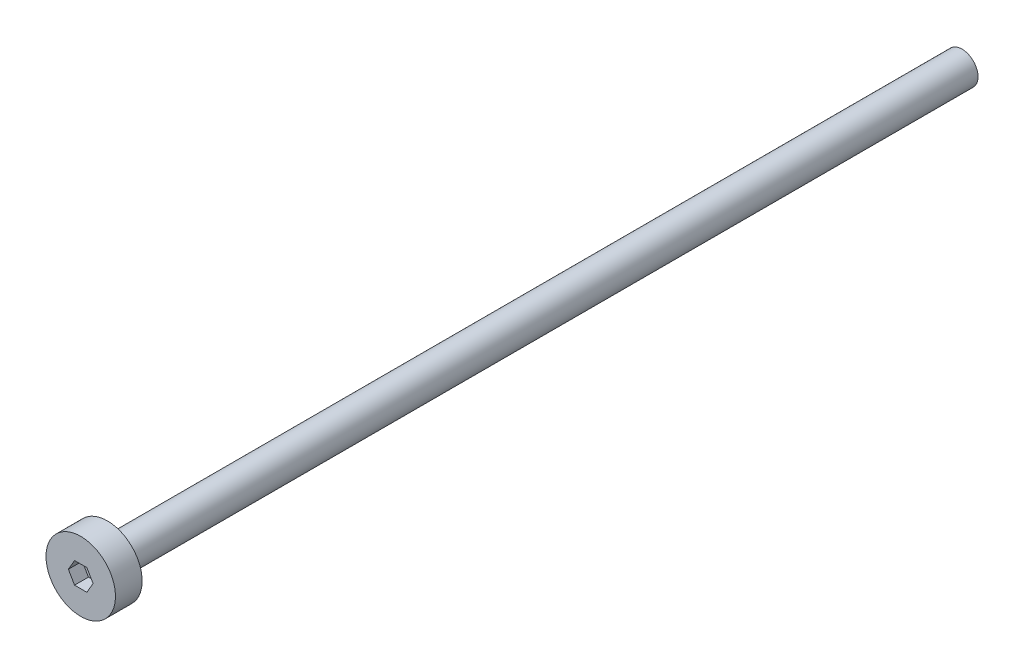
ISO-10303-21;
HEADER;
FILE_DESCRIPTION(('STEP AP214'),'2;1');
FILE_NAME('part.step','',(''),(''),'','','');
FILE_SCHEMA(('AUTOMOTIVE_DESIGN { 1 0 10303 214 1 1 1 1 }'));
ENDSEC;
DATA;
#1=APPLICATION_CONTEXT('core data for automotive mechanical design processes');
#2=APPLICATION_PROTOCOL_DEFINITION('international standard','automotive_design',2000,#1);
#3=PRODUCT_CONTEXT('',#1,'mechanical');
#4=PRODUCT('Part','Part','',(#3));
#5=PRODUCT_RELATED_PRODUCT_CATEGORY('part','',(#4));
#6=PRODUCT_DEFINITION_FORMATION('','',#4);
#7=PRODUCT_DEFINITION_CONTEXT('part definition',#1,'design');
#8=PRODUCT_DEFINITION('design','',#6,#7);
#9=PRODUCT_DEFINITION_SHAPE('','',#8);
#10=(LENGTH_UNIT() NAMED_UNIT(*) SI_UNIT(.MILLI.,.METRE.));
#11=(NAMED_UNIT(*) PLANE_ANGLE_UNIT() SI_UNIT($,.RADIAN.));
#12=(NAMED_UNIT(*) SI_UNIT($,.STERADIAN.) SOLID_ANGLE_UNIT());
#13=UNCERTAINTY_MEASURE_WITH_UNIT(LENGTH_MEASURE(1.E-05),#10,'distance_accuracy_value','');
#14=(GEOMETRIC_REPRESENTATION_CONTEXT(3) GLOBAL_UNCERTAINTY_ASSIGNED_CONTEXT((#13)) GLOBAL_UNIT_ASSIGNED_CONTEXT((#10,
#11,#12)) REPRESENTATION_CONTEXT('',''));
#15=CARTESIAN_POINT('',(0.,0.,0.));
#16=DIRECTION('',(0.,0.,1.));
#17=DIRECTION('',(1.,0.,0.));
#18=AXIS2_PLACEMENT_3D('',#15,#16,#17);
#19=CARTESIAN_POINT('',(0.,0.,1.2));
#20=DIRECTION('',(0.,0.,1.));
#21=DIRECTION('',(1.,0.,0.));
#22=AXIS2_PLACEMENT_3D('',#19,#20,#21);
#23=PLANE('',#22);
#24=DIRECTION('',(-0.50000000000019,0.866025403784329,0.));
#25=VECTOR('',#24,1.);
#26=CARTESIAN_POINT('',(1.154700538379,0.,1.2));
#27=LINE('',#26,#25);
#28=CARTESIAN_POINT('',(1.154700538379,0.,1.2));
#29=VERTEX_POINT('',#28);
#30=CARTESIAN_POINT('',(0.57735026919,1.,1.2));
#31=VERTEX_POINT('',#30);
#32=EDGE_CURVE('E9',#29,#31,#27,.T.);
#33=ORIENTED_EDGE('',*,*,#32,.T.);
#34=DIRECTION('',(-1.,0.,0.));
#35=VECTOR('',#34,1.);
#36=CARTESIAN_POINT('',(0.57735026919,1.,1.2));
#37=LINE('',#36,#35);
#38=CARTESIAN_POINT('',(-0.57735026919,1.,1.2));
#39=VERTEX_POINT('',#38);
#40=EDGE_CURVE('E117',#31,#39,#37,.T.);
#41=ORIENTED_EDGE('',*,*,#40,.T.);
#42=DIRECTION('',(-0.50000000000019,-0.866025403784329,0.));
#43=VECTOR('',#42,1.);
#44=CARTESIAN_POINT('',(-0.57735026919,1.,1.2));
#45=LINE('',#44,#43);
#46=CARTESIAN_POINT('',(-1.154700538379,0.,1.2));
#47=VERTEX_POINT('',#46);
#48=EDGE_CURVE('E111',#39,#47,#45,.T.);
#49=ORIENTED_EDGE('',*,*,#48,.T.);
#50=DIRECTION('',(0.50000000000019,-0.866025403784329,0.));
#51=VECTOR('',#50,1.);
#52=CARTESIAN_POINT('',(-1.154700538379,0.,1.2));
#53=LINE('',#52,#51);
#54=CARTESIAN_POINT('',(-0.57735026919,-1.,1.2));
#55=VERTEX_POINT('',#54);
#56=EDGE_CURVE('E115',#47,#55,#53,.T.);
#57=ORIENTED_EDGE('',*,*,#56,.T.);
#58=DIRECTION('',(1.,0.,0.));
#59=VECTOR('',#58,1.);
#60=CARTESIAN_POINT('',(-0.57735026919,-1.,1.2));
#61=LINE('',#60,#59);
#62=CARTESIAN_POINT('',(0.57735026919,-1.,1.2));
#63=VERTEX_POINT('',#62);
#64=EDGE_CURVE('E139',#55,#63,#61,.T.);
#65=ORIENTED_EDGE('',*,*,#64,.T.);
#66=DIRECTION('',(0.50000000000019,0.866025403784329,0.));
#67=VECTOR('',#66,1.);
#68=CARTESIAN_POINT('',(0.57735026919,-1.,1.2));
#69=LINE('',#68,#67);
#70=EDGE_CURVE('E159',#63,#29,#69,.T.);
#71=ORIENTED_EDGE('',*,*,#70,.T.);
#72=EDGE_LOOP('',(#33,#41,#49,#57,#65,#71));
#73=FACE_BOUND('',#72,.T.);
#74=ADVANCED_FACE('F14',(#73),#23,.T.);
#75=CARTESIAN_POINT('',(0.,0.,-80.));
#76=DIRECTION('',(0.,0.,-1.));
#77=DIRECTION('',(0.,-1.,0.));
#78=AXIS2_PLACEMENT_3D('',#75,#76,#77);
#79=PLANE('',#78);
#80=CARTESIAN_POINT('',(0.,0.,-80.));
#81=DIRECTION('',(0.,0.,-1.));
#82=DIRECTION('',(-1.,0.,0.));
#83=AXIS2_PLACEMENT_3D('',#80,#81,#82);
#84=CIRCLE('',#83,1.5);
#85=CARTESIAN_POINT('',(-1.5,0.,-80.));
#86=VERTEX_POINT('',#85);
#87=EDGE_CURVE('E149',#86,#86,#84,.T.);
#88=ORIENTED_EDGE('',*,*,#87,.T.);
#89=EDGE_LOOP('',(#88));
#90=FACE_BOUND('',#89,.T.);
#91=ADVANCED_FACE('F222',(#90),#79,.T.);
#92=CARTESIAN_POINT('',(1.154700538379,0.,1.2));
#93=DIRECTION('',(-0.866025403784329,-0.50000000000019,0.));
#94=DIRECTION('',(-0.50000000000019,0.866025403784329,0.));
#95=AXIS2_PLACEMENT_3D('',#92,#93,#94);
#96=PLANE('',#95);
#97=ORIENTED_EDGE('',*,*,#32,.F.);
#98=DIRECTION('',(0.,0.,1.));
#99=VECTOR('',#98,1.);
#100=CARTESIAN_POINT('',(1.154700538379,0.,1.2));
#101=LINE('',#100,#99);
#102=CARTESIAN_POINT('',(1.154700538379,0.,2.5));
#103=VERTEX_POINT('',#102);
#104=EDGE_CURVE('E18',#29,#103,#101,.T.);
#105=ORIENTED_EDGE('',*,*,#104,.T.);
#106=DIRECTION('',(-0.50000000000019,0.866025403784329,0.));
#107=VECTOR('',#106,1.);
#108=CARTESIAN_POINT('',(1.010362971082,0.25,2.5));
#109=LINE('',#108,#107);
#110=CARTESIAN_POINT('',(0.57735026919,1.,2.5));
#111=VERTEX_POINT('',#110);
#112=EDGE_CURVE('E150',#103,#111,#109,.T.);
#113=ORIENTED_EDGE('',*,*,#112,.T.);
#114=DIRECTION('',(0.,0.,1.));
#115=VECTOR('',#114,1.);
#116=CARTESIAN_POINT('',(0.57735026919,1.,1.2));
#117=LINE('',#116,#115);
#118=EDGE_CURVE('E25',#31,#111,#117,.T.);
#119=ORIENTED_EDGE('',*,*,#118,.F.);
#120=EDGE_LOOP('',(#97,#105,#113,#119));
#121=FACE_BOUND('',#120,.T.);
#122=ADVANCED_FACE('F16',(#121),#96,.T.);
#123=CARTESIAN_POINT('',(0.57735026919,1.,1.2));
#124=DIRECTION('',(0.,-1.,0.));
#125=DIRECTION('',(-1.,0.,0.));
#126=AXIS2_PLACEMENT_3D('',#123,#124,#125);
#127=PLANE('',#126);
#128=ORIENTED_EDGE('',*,*,#40,.F.);
#129=ORIENTED_EDGE('',*,*,#118,.T.);
#130=DIRECTION('',(-1.,0.,0.));
#131=VECTOR('',#130,1.);
#132=CARTESIAN_POINT('',(0.288675134595,1.,2.5));
#133=LINE('',#132,#131);
#134=CARTESIAN_POINT('',(-0.57735026919,1.,2.5));
#135=VERTEX_POINT('',#134);
#136=EDGE_CURVE('E173',#111,#135,#133,.T.);
#137=ORIENTED_EDGE('',*,*,#136,.T.);
#138=DIRECTION('',(0.,0.,1.));
#139=VECTOR('',#138,1.);
#140=CARTESIAN_POINT('',(-0.57735026919,1.,1.2));
#141=LINE('',#140,#139);
#142=EDGE_CURVE('E122',#39,#135,#141,.T.);
#143=ORIENTED_EDGE('',*,*,#142,.F.);
#144=EDGE_LOOP('',(#128,#129,#137,#143));
#145=FACE_BOUND('',#144,.T.);
#146=ADVANCED_FACE('F210',(#145),#127,.T.);
#147=CARTESIAN_POINT('',(-0.57735026919,1.,1.2));
#148=DIRECTION('',(0.866025403784329,-0.50000000000019,0.));
#149=DIRECTION('',(0.,0.,-1.));
#150=AXIS2_PLACEMENT_3D('',#147,#148,#149);
#151=PLANE('',#150);
#152=ORIENTED_EDGE('',*,*,#48,.F.);
#153=ORIENTED_EDGE('',*,*,#142,.T.);
#154=DIRECTION('',(-0.50000000000019,-0.866025403784329,0.));
#155=VECTOR('',#154,1.);
#156=CARTESIAN_POINT('',(-0.721687836487,0.75,2.5));
#157=LINE('',#156,#155);
#158=CARTESIAN_POINT('',(-1.154700538379,0.,2.5));
#159=VERTEX_POINT('',#158);
#160=EDGE_CURVE('E128',#135,#159,#157,.T.);
#161=ORIENTED_EDGE('',*,*,#160,.T.);
#162=DIRECTION('',(0.,0.,1.));
#163=VECTOR('',#162,1.);
#164=CARTESIAN_POINT('',(-1.154700538379,0.,1.2));
#165=LINE('',#164,#163);
#166=EDGE_CURVE('E123',#47,#159,#165,.T.);
#167=ORIENTED_EDGE('',*,*,#166,.F.);
#168=EDGE_LOOP('',(#152,#153,#161,#167));
#169=FACE_BOUND('',#168,.T.);
#170=ADVANCED_FACE('F126',(#169),#151,.T.);
#171=CARTESIAN_POINT('',(-1.154700538379,0.,1.2));
#172=DIRECTION('',(0.866025403784329,0.50000000000019,0.));
#173=DIRECTION('',(0.,0.,-1.));
#174=AXIS2_PLACEMENT_3D('',#171,#172,#173);
#175=PLANE('',#174);
#176=ORIENTED_EDGE('',*,*,#56,.F.);
#177=ORIENTED_EDGE('',*,*,#166,.T.);
#178=DIRECTION('',(0.50000000000019,-0.866025403784329,0.));
#179=VECTOR('',#178,1.);
#180=CARTESIAN_POINT('',(-1.010362971082,-0.25,2.5));
#181=LINE('',#180,#179);
#182=CARTESIAN_POINT('',(-0.57735026919,-1.,2.5));
#183=VERTEX_POINT('',#182);
#184=EDGE_CURVE('E156',#159,#183,#181,.T.);
#185=ORIENTED_EDGE('',*,*,#184,.T.);
#186=DIRECTION('',(0.,0.,1.));
#187=VECTOR('',#186,1.);
#188=CARTESIAN_POINT('',(-0.57735026919,-1.,1.2));
#189=LINE('',#188,#187);
#190=EDGE_CURVE('E88',#55,#183,#189,.T.);
#191=ORIENTED_EDGE('',*,*,#190,.F.);
#192=EDGE_LOOP('',(#176,#177,#185,#191));
#193=FACE_BOUND('',#192,.T.);
#194=ADVANCED_FACE('F133',(#193),#175,.T.);
#195=CARTESIAN_POINT('',(-0.57735026919,-1.,1.2));
#196=DIRECTION('',(0.,1.,0.));
#197=DIRECTION('',(1.,0.,0.));
#198=AXIS2_PLACEMENT_3D('',#195,#196,#197);
#199=PLANE('',#198);
#200=ORIENTED_EDGE('',*,*,#64,.F.);
#201=ORIENTED_EDGE('',*,*,#190,.T.);
#202=DIRECTION('',(1.,0.,0.));
#203=VECTOR('',#202,1.);
#204=CARTESIAN_POINT('',(-0.288675134595,-1.,2.5));
#205=LINE('',#204,#203);
#206=CARTESIAN_POINT('',(0.57735026919,-1.,2.5));
#207=VERTEX_POINT('',#206);
#208=EDGE_CURVE('E154',#183,#207,#205,.T.);
#209=ORIENTED_EDGE('',*,*,#208,.T.);
#210=DIRECTION('',(0.,0.,1.));
#211=VECTOR('',#210,1.);
#212=CARTESIAN_POINT('',(0.57735026919,-1.,1.2));
#213=LINE('',#212,#211);
#214=EDGE_CURVE('E100',#63,#207,#213,.T.);
#215=ORIENTED_EDGE('',*,*,#214,.F.);
#216=EDGE_LOOP('',(#200,#201,#209,#215));
#217=FACE_BOUND('',#216,.T.);
#218=ADVANCED_FACE('F255',(#217),#199,.T.);
#219=CARTESIAN_POINT('',(0.57735026919,-1.,1.2));
#220=DIRECTION('',(-0.866025403784329,0.50000000000019,0.));
#221=DIRECTION('',(0.,0.,1.));
#222=AXIS2_PLACEMENT_3D('',#219,#220,#221);
#223=PLANE('',#222);
#224=ORIENTED_EDGE('',*,*,#70,.F.);
#225=ORIENTED_EDGE('',*,*,#214,.T.);
#226=DIRECTION('',(0.50000000000019,0.866025403784329,0.));
#227=VECTOR('',#226,1.);
#228=CARTESIAN_POINT('',(0.721687836487,-0.75,2.5));
#229=LINE('',#228,#227);
#230=EDGE_CURVE('E146',#207,#103,#229,.T.);
#231=ORIENTED_EDGE('',*,*,#230,.T.);
#232=ORIENTED_EDGE('',*,*,#104,.F.);
#233=EDGE_LOOP('',(#224,#225,#231,#232));
#234=FACE_BOUND('',#233,.T.);
#235=ADVANCED_FACE('F204',(#234),#223,.T.);
#236=CARTESIAN_POINT('',(0.,0.,0.));
#237=DIRECTION('',(0.,0.,-1.));
#238=DIRECTION('',(-1.,0.,0.));
#239=AXIS2_PLACEMENT_3D('',#236,#237,#238);
#240=CYLINDRICAL_SURFACE('',#239,1.5);
#241=ORIENTED_EDGE('',*,*,#87,.F.);
#242=DIRECTION('',(0.,0.,-1.));
#243=VECTOR('',#242,1.);
#244=CARTESIAN_POINT('',(-1.5,0.,0.));
#245=LINE('',#244,#243);
#246=CARTESIAN_POINT('',(-1.5,0.,0.));
#247=VERTEX_POINT('',#246);
#248=EDGE_CURVE('E162',#247,#86,#245,.T.);
#249=ORIENTED_EDGE('',*,*,#248,.F.);
#250=CARTESIAN_POINT('',(0.,0.,0.));
#251=DIRECTION('',(0.,0.,-1.));
#252=DIRECTION('',(-1.,0.,0.));
#253=AXIS2_PLACEMENT_3D('',#250,#251,#252);
#254=CIRCLE('',#253,1.5);
#255=EDGE_CURVE('E157',#247,#247,#254,.T.);
#256=ORIENTED_EDGE('',*,*,#255,.T.);
#257=ORIENTED_EDGE('',*,*,#248,.T.);
#258=EDGE_LOOP('',(#241,#249,#256,#257));
#259=FACE_BOUND('',#258,.T.);
#260=ADVANCED_FACE('F274',(#259),#240,.T.);
#261=CARTESIAN_POINT('',(0.,0.,2.5));
#262=DIRECTION('',(0.,0.,-1.));
#263=DIRECTION('',(0.,-1.,0.));
#264=AXIS2_PLACEMENT_3D('',#261,#262,#263);
#265=PLANE('',#264);
#266=ORIENTED_EDGE('',*,*,#208,.F.);
#267=ORIENTED_EDGE('',*,*,#184,.F.);
#268=ORIENTED_EDGE('',*,*,#160,.F.);
#269=ORIENTED_EDGE('',*,*,#136,.F.);
#270=ORIENTED_EDGE('',*,*,#112,.F.);
#271=ORIENTED_EDGE('',*,*,#230,.F.);
#272=EDGE_LOOP('',(#266,#267,#268,#269,#270,#271));
#273=FACE_BOUND('',#272,.T.);
#274=CARTESIAN_POINT('',(0.,0.,2.5));
#275=DIRECTION('',(0.,0.,-1.));
#276=DIRECTION('',(-1.,0.,0.));
#277=AXIS2_PLACEMENT_3D('',#274,#275,#276);
#278=CIRCLE('',#277,3.25);
#279=CARTESIAN_POINT('',(-3.25,0.,2.5));
#280=VERTEX_POINT('',#279);
#281=EDGE_CURVE('E62',#280,#280,#278,.T.);
#282=ORIENTED_EDGE('',*,*,#281,.F.);
#283=EDGE_LOOP('',(#282));
#284=FACE_BOUND('',#283,.T.);
#285=ADVANCED_FACE('F207',(#273,#284),#265,.F.);
#286=CARTESIAN_POINT('',(0.,0.,0.));
#287=DIRECTION('',(0.,0.,-1.));
#288=DIRECTION('',(0.,-1.,0.));
#289=AXIS2_PLACEMENT_3D('',#286,#287,#288);
#290=PLANE('',#289);
#291=ORIENTED_EDGE('',*,*,#255,.F.);
#292=EDGE_LOOP('',(#291));
#293=FACE_BOUND('',#292,.T.);
#294=CARTESIAN_POINT('',(0.,0.,0.));
#295=DIRECTION('',(0.,0.,-1.));
#296=DIRECTION('',(-1.,0.,0.));
#297=AXIS2_PLACEMENT_3D('',#294,#295,#296);
#298=CIRCLE('',#297,3.25);
#299=CARTESIAN_POINT('',(-3.25,0.,0.));
#300=VERTEX_POINT('',#299);
#301=EDGE_CURVE('E165',#300,#300,#298,.T.);
#302=ORIENTED_EDGE('',*,*,#301,.T.);
#303=EDGE_LOOP('',(#302));
#304=FACE_BOUND('',#303,.T.);
#305=ADVANCED_FACE('F236',(#293,#304),#290,.T.);
#306=CARTESIAN_POINT('',(0.,0.,2.5));
#307=DIRECTION('',(0.,0.,-1.));
#308=DIRECTION('',(-1.,0.,0.));
#309=AXIS2_PLACEMENT_3D('',#306,#307,#308);
#310=CYLINDRICAL_SURFACE('',#309,3.25);
#311=ORIENTED_EDGE('',*,*,#301,.F.);
#312=DIRECTION('',(0.,0.,-1.));
#313=VECTOR('',#312,1.);
#314=CARTESIAN_POINT('',(-3.25,0.,2.5));
#315=LINE('',#314,#313);
#316=EDGE_CURVE('E54',#280,#300,#315,.T.);
#317=ORIENTED_EDGE('',*,*,#316,.F.);
#318=ORIENTED_EDGE('',*,*,#281,.T.);
#319=ORIENTED_EDGE('',*,*,#316,.T.);
#320=EDGE_LOOP('',(#311,#317,#318,#319));
#321=FACE_BOUND('',#320,.T.);
#322=ADVANCED_FACE('F231',(#321),#310,.T.);
#323=CLOSED_SHELL('',(#74,#91,#122,#146,#170,#194,#218,#235,#260,#285,#305,#322));
#324=MANIFOLD_SOLID_BREP('B1',#323);
#325=ADVANCED_BREP_SHAPE_REPRESENTATION('',(#18,#324),#14);
#326=SHAPE_DEFINITION_REPRESENTATION(#9,#325);
ENDSEC;
END-ISO-10303-21;
